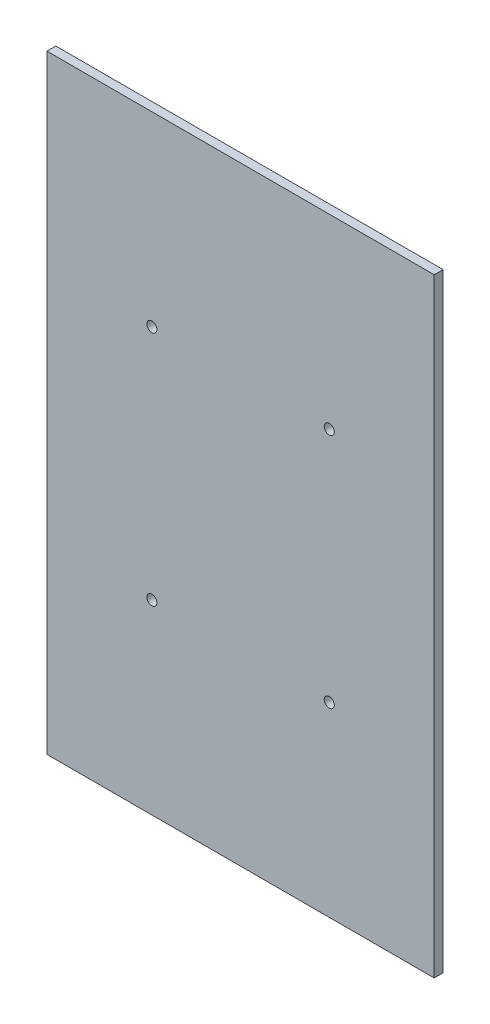
ISO-10303-21;
HEADER;
FILE_DESCRIPTION(('STEP AP214'),'2;1');
FILE_NAME('part.step','',(''),(''),'','','');
FILE_SCHEMA(('AUTOMOTIVE_DESIGN { 1 0 10303 214 1 1 1 1 }'));
ENDSEC;
DATA;
#1=APPLICATION_CONTEXT('core data for automotive mechanical design processes');
#2=APPLICATION_PROTOCOL_DEFINITION('international standard','automotive_design',2000,#1);
#3=PRODUCT_CONTEXT('',#1,'mechanical');
#4=PRODUCT('Part','Part','',(#3));
#5=PRODUCT_RELATED_PRODUCT_CATEGORY('part','',(#4));
#6=PRODUCT_DEFINITION_FORMATION('','',#4);
#7=PRODUCT_DEFINITION_CONTEXT('part definition',#1,'design');
#8=PRODUCT_DEFINITION('design','',#6,#7);
#9=PRODUCT_DEFINITION_SHAPE('','',#8);
#10=(LENGTH_UNIT() NAMED_UNIT(*) SI_UNIT(.MILLI.,.METRE.));
#11=(NAMED_UNIT(*) PLANE_ANGLE_UNIT() SI_UNIT($,.RADIAN.));
#12=(NAMED_UNIT(*) SI_UNIT($,.STERADIAN.) SOLID_ANGLE_UNIT());
#13=UNCERTAINTY_MEASURE_WITH_UNIT(LENGTH_MEASURE(1.E-05),#10,'distance_accuracy_value','');
#14=(GEOMETRIC_REPRESENTATION_CONTEXT(3) GLOBAL_UNCERTAINTY_ASSIGNED_CONTEXT((#13)) GLOBAL_UNIT_ASSIGNED_CONTEXT((#10,
#11,#12)) REPRESENTATION_CONTEXT('',''));
#15=CARTESIAN_POINT('',(0.,0.,0.));
#16=DIRECTION('',(0.,0.,1.));
#17=DIRECTION('',(1.,0.,0.));
#18=AXIS2_PLACEMENT_3D('',#15,#16,#17);
#19=CARTESIAN_POINT('',(65.5,-103.,3.));
#20=DIRECTION('',(-1.,0.,0.));
#21=DIRECTION('',(0.,0.,1.));
#22=AXIS2_PLACEMENT_3D('',#19,#20,#21);
#23=PLANE('',#22);
#24=DIRECTION('',(0.,1.,0.));
#25=VECTOR('',#24,1.);
#26=CARTESIAN_POINT('',(65.5,-103.,0.));
#27=LINE('',#26,#25);
#28=CARTESIAN_POINT('',(65.5,-103.,0.));
#29=VERTEX_POINT('',#28);
#30=CARTESIAN_POINT('',(65.5,103.,0.));
#31=VERTEX_POINT('',#30);
#32=EDGE_CURVE('E106',#29,#31,#27,.T.);
#33=ORIENTED_EDGE('',*,*,#32,.T.);
#34=DIRECTION('',(0.,0.,-1.));
#35=VECTOR('',#34,1.);
#36=CARTESIAN_POINT('',(65.5,103.,3.));
#37=LINE('',#36,#35);
#38=CARTESIAN_POINT('',(65.5,103.,3.));
#39=VERTEX_POINT('',#38);
#40=EDGE_CURVE('E11',#39,#31,#37,.T.);
#41=ORIENTED_EDGE('',*,*,#40,.F.);
#42=DIRECTION('',(0.,1.,0.));
#43=VECTOR('',#42,1.);
#44=CARTESIAN_POINT('',(65.5,-103.,3.));
#45=LINE('',#44,#43);
#46=CARTESIAN_POINT('',(65.5,-103.,3.));
#47=VERTEX_POINT('',#46);
#48=EDGE_CURVE('E90',#47,#39,#45,.T.);
#49=ORIENTED_EDGE('',*,*,#48,.F.);
#50=DIRECTION('',(0.,0.,-1.));
#51=VECTOR('',#50,1.);
#52=CARTESIAN_POINT('',(65.5,-103.,3.));
#53=LINE('',#52,#51);
#54=EDGE_CURVE('E102',#47,#29,#53,.T.);
#55=ORIENTED_EDGE('',*,*,#54,.T.);
#56=EDGE_LOOP('',(#33,#41,#49,#55));
#57=FACE_BOUND('',#56,.T.);
#58=ADVANCED_FACE('F38',(#57),#23,.F.);
#59=CARTESIAN_POINT('',(-65.5,103.,3.));
#60=DIRECTION('',(0.,-1.,0.));
#61=DIRECTION('',(0.,0.,-1.));
#62=AXIS2_PLACEMENT_3D('',#59,#60,#61);
#63=PLANE('',#62);
#64=DIRECTION('',(-1.,0.,0.));
#65=VECTOR('',#64,1.);
#66=CARTESIAN_POINT('',(-65.5,103.,0.));
#67=LINE('',#66,#65);
#68=CARTESIAN_POINT('',(-65.5,103.,0.));
#69=VERTEX_POINT('',#68);
#70=EDGE_CURVE('E95',#31,#69,#67,.T.);
#71=ORIENTED_EDGE('',*,*,#70,.T.);
#72=DIRECTION('',(0.,0.,-1.));
#73=VECTOR('',#72,1.);
#74=CARTESIAN_POINT('',(-65.5,103.,3.));
#75=LINE('',#74,#73);
#76=CARTESIAN_POINT('',(-65.5,103.,3.));
#77=VERTEX_POINT('',#76);
#78=EDGE_CURVE('E47',#77,#69,#75,.T.);
#79=ORIENTED_EDGE('',*,*,#78,.F.);
#80=DIRECTION('',(-1.,0.,0.));
#81=VECTOR('',#80,1.);
#82=CARTESIAN_POINT('',(-65.5,103.,3.));
#83=LINE('',#82,#81);
#84=EDGE_CURVE('E85',#39,#77,#83,.T.);
#85=ORIENTED_EDGE('',*,*,#84,.F.);
#86=ORIENTED_EDGE('',*,*,#40,.T.);
#87=EDGE_LOOP('',(#71,#79,#85,#86));
#88=FACE_BOUND('',#87,.T.);
#89=ADVANCED_FACE('F94',(#88),#63,.F.);
#90=CARTESIAN_POINT('',(-65.5,-103.,3.));
#91=DIRECTION('',(1.,0.,0.));
#92=DIRECTION('',(0.,0.,-1.));
#93=AXIS2_PLACEMENT_3D('',#90,#91,#92);
#94=PLANE('',#93);
#95=DIRECTION('',(0.,-1.,0.));
#96=VECTOR('',#95,1.);
#97=CARTESIAN_POINT('',(-65.5,-103.,0.));
#98=LINE('',#97,#96);
#99=CARTESIAN_POINT('',(-65.5,-103.,0.));
#100=VERTEX_POINT('',#99);
#101=EDGE_CURVE('E72',#69,#100,#98,.T.);
#102=ORIENTED_EDGE('',*,*,#101,.T.);
#103=DIRECTION('',(0.,0.,-1.));
#104=VECTOR('',#103,1.);
#105=CARTESIAN_POINT('',(-65.5,-103.,3.));
#106=LINE('',#105,#104);
#107=CARTESIAN_POINT('',(-65.5,-103.,3.));
#108=VERTEX_POINT('',#107);
#109=EDGE_CURVE('E97',#108,#100,#106,.T.);
#110=ORIENTED_EDGE('',*,*,#109,.F.);
#111=DIRECTION('',(0.,-1.,0.));
#112=VECTOR('',#111,1.);
#113=CARTESIAN_POINT('',(-65.5,-103.,3.));
#114=LINE('',#113,#112);
#115=EDGE_CURVE('E88',#77,#108,#114,.T.);
#116=ORIENTED_EDGE('',*,*,#115,.F.);
#117=ORIENTED_EDGE('',*,*,#78,.T.);
#118=EDGE_LOOP('',(#102,#110,#116,#117));
#119=FACE_BOUND('',#118,.T.);
#120=ADVANCED_FACE('F98',(#119),#94,.F.);
#121=CARTESIAN_POINT('',(-65.5,-103.,3.));
#122=DIRECTION('',(0.,1.,0.));
#123=DIRECTION('',(0.,0.,1.));
#124=AXIS2_PLACEMENT_3D('',#121,#122,#123);
#125=PLANE('',#124);
#126=DIRECTION('',(1.,0.,0.));
#127=VECTOR('',#126,1.);
#128=CARTESIAN_POINT('',(-65.5,-103.,0.));
#129=LINE('',#128,#127);
#130=EDGE_CURVE('E78',#100,#29,#129,.T.);
#131=ORIENTED_EDGE('',*,*,#130,.T.);
#132=ORIENTED_EDGE('',*,*,#54,.F.);
#133=DIRECTION('',(1.,0.,0.));
#134=VECTOR('',#133,1.);
#135=CARTESIAN_POINT('',(-65.5,-103.,3.));
#136=LINE('',#135,#134);
#137=EDGE_CURVE('E55',#108,#47,#136,.T.);
#138=ORIENTED_EDGE('',*,*,#137,.F.);
#139=ORIENTED_EDGE('',*,*,#109,.T.);
#140=EDGE_LOOP('',(#131,#132,#138,#139));
#141=FACE_BOUND('',#140,.T.);
#142=ADVANCED_FACE('F120',(#141),#125,.F.);
#143=CARTESIAN_POINT('',(0.,0.,3.));
#144=DIRECTION('',(0.,0.,-1.));
#145=DIRECTION('',(-1.,0.,0.));
#146=AXIS2_PLACEMENT_3D('',#143,#144,#145);
#147=PLANE('',#146);
#148=CARTESIAN_POINT('',(-30.,40.,3.));
#149=DIRECTION('',(0.,0.,-1.));
#150=DIRECTION('',(1.,0.,0.));
#151=AXIS2_PLACEMENT_3D('',#148,#149,#150);
#152=CIRCLE('',#151,1.7);
#153=CARTESIAN_POINT('',(-28.3,40.,3.));
#154=VERTEX_POINT('',#153);
#155=EDGE_CURVE('E139',#154,#154,#152,.T.);
#156=ORIENTED_EDGE('',*,*,#155,.T.);
#157=EDGE_LOOP('',(#156));
#158=FACE_BOUND('',#157,.T.);
#159=CARTESIAN_POINT('',(-30.,-40.,3.));
#160=DIRECTION('',(0.,0.,-1.));
#161=DIRECTION('',(-1.,0.,0.));
#162=AXIS2_PLACEMENT_3D('',#159,#160,#161);
#163=CIRCLE('',#162,1.7);
#164=CARTESIAN_POINT('',(-31.7,-40.,3.));
#165=VERTEX_POINT('',#164);
#166=EDGE_CURVE('E147',#165,#165,#163,.T.);
#167=ORIENTED_EDGE('',*,*,#166,.T.);
#168=EDGE_LOOP('',(#167));
#169=FACE_BOUND('',#168,.T.);
#170=CARTESIAN_POINT('',(30.,-40.,3.));
#171=DIRECTION('',(0.,0.,-1.));
#172=DIRECTION('',(1.,0.,0.));
#173=AXIS2_PLACEMENT_3D('',#170,#171,#172);
#174=CIRCLE('',#173,1.7);
#175=CARTESIAN_POINT('',(31.7,-40.,3.));
#176=VERTEX_POINT('',#175);
#177=EDGE_CURVE('E131',#176,#176,#174,.T.);
#178=ORIENTED_EDGE('',*,*,#177,.T.);
#179=EDGE_LOOP('',(#178));
#180=FACE_BOUND('',#179,.T.);
#181=CARTESIAN_POINT('',(30.,40.,3.));
#182=DIRECTION('',(0.,0.,-1.));
#183=DIRECTION('',(-1.,0.,0.));
#184=AXIS2_PLACEMENT_3D('',#181,#182,#183);
#185=CIRCLE('',#184,1.7);
#186=CARTESIAN_POINT('',(28.3,40.,3.));
#187=VERTEX_POINT('',#186);
#188=EDGE_CURVE('E110',#187,#187,#185,.T.);
#189=ORIENTED_EDGE('',*,*,#188,.T.);
#190=EDGE_LOOP('',(#189));
#191=FACE_BOUND('',#190,.T.);
#192=ORIENTED_EDGE('',*,*,#48,.T.);
#193=ORIENTED_EDGE('',*,*,#84,.T.);
#194=ORIENTED_EDGE('',*,*,#115,.T.);
#195=ORIENTED_EDGE('',*,*,#137,.T.);
#196=EDGE_LOOP('',(#192,#193,#194,#195));
#197=FACE_BOUND('',#196,.T.);
#198=ADVANCED_FACE('F86',(#158,#169,#180,#191,#197),#147,.F.);
#199=CARTESIAN_POINT('',(0.,0.,0.));
#200=DIRECTION('',(0.,0.,-1.));
#201=DIRECTION('',(-1.,0.,0.));
#202=AXIS2_PLACEMENT_3D('',#199,#200,#201);
#203=PLANE('',#202);
#204=CARTESIAN_POINT('',(-30.,40.,0.));
#205=DIRECTION('',(0.,0.,-1.));
#206=DIRECTION('',(1.,0.,0.));
#207=AXIS2_PLACEMENT_3D('',#204,#205,#206);
#208=CIRCLE('',#207,1.7);
#209=CARTESIAN_POINT('',(-28.3,40.,0.));
#210=VERTEX_POINT('',#209);
#211=EDGE_CURVE('E135',#210,#210,#208,.T.);
#212=ORIENTED_EDGE('',*,*,#211,.F.);
#213=EDGE_LOOP('',(#212));
#214=FACE_BOUND('',#213,.T.);
#215=CARTESIAN_POINT('',(-30.,-40.,0.));
#216=DIRECTION('',(0.,0.,-1.));
#217=DIRECTION('',(-1.,0.,0.));
#218=AXIS2_PLACEMENT_3D('',#215,#216,#217);
#219=CIRCLE('',#218,1.7);
#220=CARTESIAN_POINT('',(-31.7,-40.,0.));
#221=VERTEX_POINT('',#220);
#222=EDGE_CURVE('E143',#221,#221,#219,.T.);
#223=ORIENTED_EDGE('',*,*,#222,.F.);
#224=EDGE_LOOP('',(#223));
#225=FACE_BOUND('',#224,.T.);
#226=CARTESIAN_POINT('',(30.,-40.,0.));
#227=DIRECTION('',(0.,0.,-1.));
#228=DIRECTION('',(1.,0.,0.));
#229=AXIS2_PLACEMENT_3D('',#226,#227,#228);
#230=CIRCLE('',#229,1.7);
#231=CARTESIAN_POINT('',(31.7,-40.,0.));
#232=VERTEX_POINT('',#231);
#233=EDGE_CURVE('E151',#232,#232,#230,.T.);
#234=ORIENTED_EDGE('',*,*,#233,.F.);
#235=EDGE_LOOP('',(#234));
#236=FACE_BOUND('',#235,.T.);
#237=CARTESIAN_POINT('',(30.,40.,0.));
#238=DIRECTION('',(0.,0.,-1.));
#239=DIRECTION('',(-1.,0.,0.));
#240=AXIS2_PLACEMENT_3D('',#237,#238,#239);
#241=CIRCLE('',#240,1.7);
#242=CARTESIAN_POINT('',(28.3,40.,0.));
#243=VERTEX_POINT('',#242);
#244=EDGE_CURVE('E127',#243,#243,#241,.T.);
#245=ORIENTED_EDGE('',*,*,#244,.F.);
#246=EDGE_LOOP('',(#245));
#247=FACE_BOUND('',#246,.T.);
#248=ORIENTED_EDGE('',*,*,#32,.F.);
#249=ORIENTED_EDGE('',*,*,#130,.F.);
#250=ORIENTED_EDGE('',*,*,#101,.F.);
#251=ORIENTED_EDGE('',*,*,#70,.F.);
#252=EDGE_LOOP('',(#248,#249,#250,#251));
#253=FACE_BOUND('',#252,.T.);
#254=ADVANCED_FACE('F123',(#214,#225,#236,#247,#253),#203,.T.);
#255=CARTESIAN_POINT('',(30.,40.,3.));
#256=DIRECTION('',(0.,0.,-1.));
#257=DIRECTION('',(-1.,0.,0.));
#258=AXIS2_PLACEMENT_3D('',#255,#256,#257);
#259=CYLINDRICAL_SURFACE('',#258,1.7);
#260=ORIENTED_EDGE('',*,*,#188,.F.);
#261=EDGE_LOOP('',(#260));
#262=FACE_BOUND('',#261,.T.);
#263=ORIENTED_EDGE('',*,*,#244,.T.);
#264=EDGE_LOOP('',(#263));
#265=FACE_BOUND('',#264,.T.);
#266=ADVANCED_FACE('F165',(#262,#265),#259,.F.);
#267=CARTESIAN_POINT('',(30.,-40.,3.));
#268=DIRECTION('',(0.,0.,-1.));
#269=DIRECTION('',(-1.,0.,0.));
#270=AXIS2_PLACEMENT_3D('',#267,#268,#269);
#271=CYLINDRICAL_SURFACE('',#270,1.7);
#272=ORIENTED_EDGE('',*,*,#177,.F.);
#273=EDGE_LOOP('',(#272));
#274=FACE_BOUND('',#273,.T.);
#275=ORIENTED_EDGE('',*,*,#233,.T.);
#276=EDGE_LOOP('',(#275));
#277=FACE_BOUND('',#276,.T.);
#278=ADVANCED_FACE('F161',(#274,#277),#271,.F.);
#279=CARTESIAN_POINT('',(-30.,-40.,3.));
#280=DIRECTION('',(0.,0.,-1.));
#281=DIRECTION('',(-1.,0.,0.));
#282=AXIS2_PLACEMENT_3D('',#279,#280,#281);
#283=CYLINDRICAL_SURFACE('',#282,1.7);
#284=ORIENTED_EDGE('',*,*,#166,.F.);
#285=EDGE_LOOP('',(#284));
#286=FACE_BOUND('',#285,.T.);
#287=ORIENTED_EDGE('',*,*,#222,.T.);
#288=EDGE_LOOP('',(#287));
#289=FACE_BOUND('',#288,.T.);
#290=ADVANCED_FACE('F164',(#286,#289),#283,.F.);
#291=CARTESIAN_POINT('',(-30.,40.,3.));
#292=DIRECTION('',(0.,0.,-1.));
#293=DIRECTION('',(-1.,0.,0.));
#294=AXIS2_PLACEMENT_3D('',#291,#292,#293);
#295=CYLINDRICAL_SURFACE('',#294,1.7);
#296=ORIENTED_EDGE('',*,*,#155,.F.);
#297=EDGE_LOOP('',(#296));
#298=FACE_BOUND('',#297,.T.);
#299=ORIENTED_EDGE('',*,*,#211,.T.);
#300=EDGE_LOOP('',(#299));
#301=FACE_BOUND('',#300,.T.);
#302=ADVANCED_FACE('F203',(#298,#301),#295,.F.);
#303=CLOSED_SHELL('',(#58,#89,#120,#142,#198,#254,#266,#278,#290,#302));
#304=MANIFOLD_SOLID_BREP('B2',#303);
#305=ADVANCED_BREP_SHAPE_REPRESENTATION('',(#18,#304),#14);
#306=SHAPE_DEFINITION_REPRESENTATION(#9,#305);
ENDSEC;
END-ISO-10303-21;
